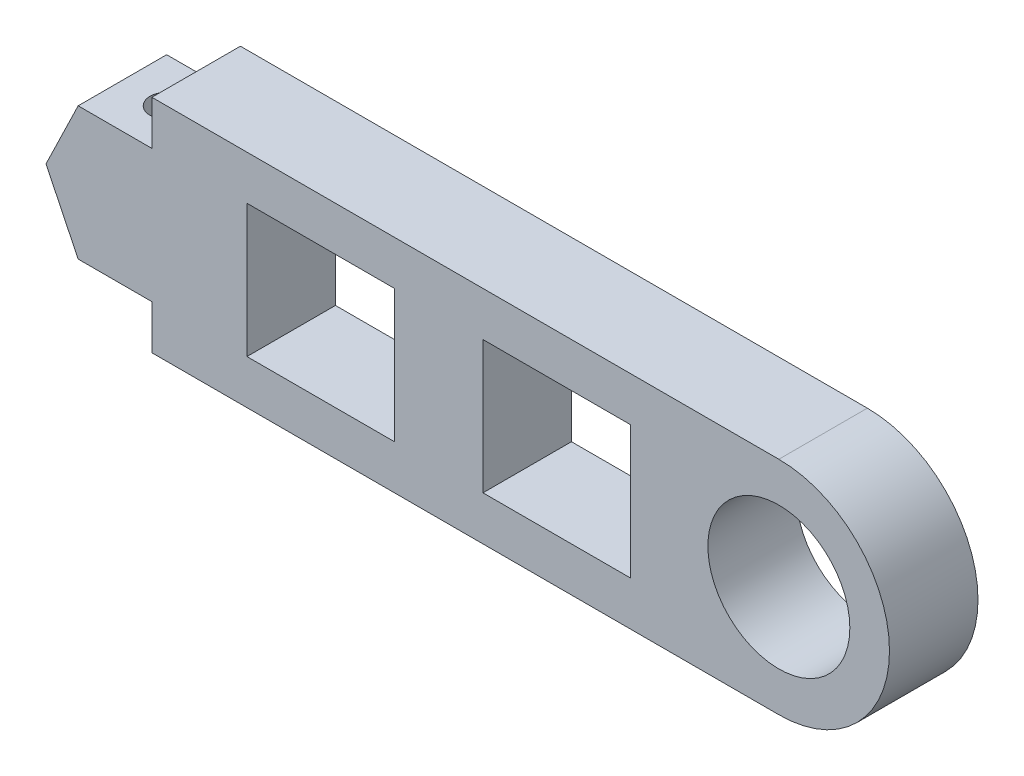
ISO-10303-21;
HEADER;
FILE_DESCRIPTION(('STEP AP214'),'2;1');
FILE_NAME('part.step','',(''),(''),'','','');
FILE_SCHEMA(('AUTOMOTIVE_DESIGN { 1 0 10303 214 1 1 1 1 }'));
ENDSEC;
DATA;
#1=APPLICATION_CONTEXT('core data for automotive mechanical design processes');
#2=APPLICATION_PROTOCOL_DEFINITION('international standard','automotive_design',2000,#1);
#3=PRODUCT_CONTEXT('',#1,'mechanical');
#4=PRODUCT('Part','Part','',(#3));
#5=PRODUCT_RELATED_PRODUCT_CATEGORY('part','',(#4));
#6=PRODUCT_DEFINITION_FORMATION('','',#4);
#7=PRODUCT_DEFINITION_CONTEXT('part definition',#1,'design');
#8=PRODUCT_DEFINITION('design','',#6,#7);
#9=PRODUCT_DEFINITION_SHAPE('','',#8);
#10=(LENGTH_UNIT() NAMED_UNIT(*) SI_UNIT(.MILLI.,.METRE.));
#11=(NAMED_UNIT(*) PLANE_ANGLE_UNIT() SI_UNIT($,.RADIAN.));
#12=(NAMED_UNIT(*) SI_UNIT($,.STERADIAN.) SOLID_ANGLE_UNIT());
#13=UNCERTAINTY_MEASURE_WITH_UNIT(LENGTH_MEASURE(1.E-05),#10,'distance_accuracy_value','');
#14=(GEOMETRIC_REPRESENTATION_CONTEXT(3) GLOBAL_UNCERTAINTY_ASSIGNED_CONTEXT((#13)) GLOBAL_UNIT_ASSIGNED_CONTEXT((#10,
#11,#12)) REPRESENTATION_CONTEXT('',''));
#15=CARTESIAN_POINT('',(0.,0.,0.));
#16=DIRECTION('',(0.,0.,1.));
#17=DIRECTION('',(1.,0.,0.));
#18=AXIS2_PLACEMENT_3D('',#15,#16,#17);
#19=CARTESIAN_POINT('',(85.,0.,12.));
#20=DIRECTION('',(0.,0.,1.));
#21=DIRECTION('',(1.,0.,0.));
#22=AXIS2_PLACEMENT_3D('',#19,#20,#21);
#23=PLANE('',#22);
#24=DIRECTION('',(-1.,0.,0.));
#25=VECTOR('',#24,1.);
#26=CARTESIAN_POINT('',(0.,8.99999999999998,12.));
#27=LINE('',#26,#25);
#28=CARTESIAN_POINT('',(0.,8.99999999999998,12.));
#29=VERTEX_POINT('',#28);
#30=CARTESIAN_POINT('',(-10.,8.99999999999998,12.));
#31=VERTEX_POINT('',#30);
#32=EDGE_CURVE('E227',#29,#31,#27,.T.);
#33=ORIENTED_EDGE('',*,*,#32,.T.);
#34=DIRECTION('',(-0.435889894354068,-0.9,0.));
#35=VECTOR('',#34,1.);
#36=CARTESIAN_POINT('',(-10.,8.99999999999998,12.));
#37=LINE('',#36,#35);
#38=CARTESIAN_POINT('',(-14.3588989435407,0.,12.));
#39=VERTEX_POINT('',#38);
#40=EDGE_CURVE('E230',#31,#39,#37,.T.);
#41=ORIENTED_EDGE('',*,*,#40,.T.);
#42=DIRECTION('',(0.435889894354067,-0.9,0.));
#43=VECTOR('',#42,1.);
#44=CARTESIAN_POINT('',(-14.3588989435407,0.,12.));
#45=LINE('',#44,#43);
#46=CARTESIAN_POINT('',(-10.,-9.,12.));
#47=VERTEX_POINT('',#46);
#48=EDGE_CURVE('E233',#39,#47,#45,.T.);
#49=ORIENTED_EDGE('',*,*,#48,.T.);
#50=DIRECTION('',(1.,0.,0.));
#51=VECTOR('',#50,1.);
#52=CARTESIAN_POINT('',(-10.,-9.,12.));
#53=LINE('',#52,#51);
#54=CARTESIAN_POINT('',(0.,-9.,12.));
#55=VERTEX_POINT('',#54);
#56=EDGE_CURVE('E235',#47,#55,#53,.T.);
#57=ORIENTED_EDGE('',*,*,#56,.T.);
#58=DIRECTION('',(0.,-1.,0.));
#59=VECTOR('',#58,1.);
#60=CARTESIAN_POINT('',(0.,-9.,12.));
#61=LINE('',#60,#59);
#62=CARTESIAN_POINT('',(0.,-15.,12.));
#63=VERTEX_POINT('',#62);
#64=EDGE_CURVE('E237',#55,#63,#61,.T.);
#65=ORIENTED_EDGE('',*,*,#64,.T.);
#66=DIRECTION('',(1.,0.,0.));
#67=VECTOR('',#66,1.);
#68=CARTESIAN_POINT('',(0.,-15.,12.));
#69=LINE('',#68,#67);
#70=CARTESIAN_POINT('',(85.,-15.,12.));
#71=VERTEX_POINT('',#70);
#72=EDGE_CURVE('E239',#63,#71,#69,.T.);
#73=ORIENTED_EDGE('',*,*,#72,.T.);
#74=CARTESIAN_POINT('',(85.,0.,12.));
#75=DIRECTION('',(0.,0.,1.));
#76=DIRECTION('',(1.,0.,0.));
#77=AXIS2_PLACEMENT_3D('',#74,#75,#76);
#78=CIRCLE('',#77,15.);
#79=CARTESIAN_POINT('',(85.,15.,12.));
#80=VERTEX_POINT('',#79);
#81=EDGE_CURVE('E241',#71,#80,#78,.T.);
#82=ORIENTED_EDGE('',*,*,#81,.T.);
#83=DIRECTION('',(-1.,0.,0.));
#84=VECTOR('',#83,1.);
#85=CARTESIAN_POINT('',(0.,15.,12.));
#86=LINE('',#85,#84);
#87=CARTESIAN_POINT('',(0.,15.,12.));
#88=VERTEX_POINT('',#87);
#89=EDGE_CURVE('E243',#80,#88,#86,.T.);
#90=ORIENTED_EDGE('',*,*,#89,.T.);
#91=DIRECTION('',(0.,-1.,0.));
#92=VECTOR('',#91,1.);
#93=CARTESIAN_POINT('',(0.,15.,12.));
#94=LINE('',#93,#92);
#95=EDGE_CURVE('E245',#88,#29,#94,.T.);
#96=ORIENTED_EDGE('',*,*,#95,.T.);
#97=EDGE_LOOP('',(#33,#41,#49,#57,#65,#73,#82,#90,#96));
#98=FACE_BOUND('',#97,.T.);
#99=CARTESIAN_POINT('',(85.,0.,12.));
#100=DIRECTION('',(0.,0.,1.));
#101=DIRECTION('',(1.,0.,0.));
#102=AXIS2_PLACEMENT_3D('',#99,#100,#101);
#103=CIRCLE('',#102,9.62499999999999);
#104=CARTESIAN_POINT('',(94.625,0.,12.));
#105=VERTEX_POINT('',#104);
#106=EDGE_CURVE('E221',#105,#105,#103,.T.);
#107=ORIENTED_EDGE('',*,*,#106,.F.);
#108=EDGE_LOOP('',(#107));
#109=FACE_BOUND('',#108,.T.);
#110=DIRECTION('',(1.,0.,0.));
#111=VECTOR('',#110,1.);
#112=CARTESIAN_POINT('',(12.884427268704,-9.,12.));
#113=LINE('',#112,#111);
#114=CARTESIAN_POINT('',(12.884427268704,-9.,12.));
#115=VERTEX_POINT('',#114);
#116=CARTESIAN_POINT('',(32.884427268704,-9.,12.));
#117=VERTEX_POINT('',#116);
#118=EDGE_CURVE('E192',#115,#117,#113,.T.);
#119=ORIENTED_EDGE('',*,*,#118,.F.);
#120=DIRECTION('',(0.,-1.,0.));
#121=VECTOR('',#120,1.);
#122=CARTESIAN_POINT('',(12.884427268704,8.99999999999998,12.));
#123=LINE('',#122,#121);
#124=CARTESIAN_POINT('',(12.884427268704,8.99999999999998,12.));
#125=VERTEX_POINT('',#124);
#126=EDGE_CURVE('E190',#125,#115,#123,.T.);
#127=ORIENTED_EDGE('',*,*,#126,.F.);
#128=DIRECTION('',(-1.,0.,0.));
#129=VECTOR('',#128,1.);
#130=CARTESIAN_POINT('',(12.884427268704,8.99999999999998,12.));
#131=LINE('',#130,#129);
#132=CARTESIAN_POINT('',(32.884427268704,8.99999999999998,12.));
#133=VERTEX_POINT('',#132);
#134=EDGE_CURVE('E198',#133,#125,#131,.T.);
#135=ORIENTED_EDGE('',*,*,#134,.F.);
#136=DIRECTION('',(0.,1.,0.));
#137=VECTOR('',#136,1.);
#138=CARTESIAN_POINT('',(32.884427268704,8.99999999999998,12.));
#139=LINE('',#138,#137);
#140=EDGE_CURVE('E195',#117,#133,#139,.T.);
#141=ORIENTED_EDGE('',*,*,#140,.F.);
#142=EDGE_LOOP('',(#119,#127,#135,#141));
#143=FACE_BOUND('',#142,.T.);
#144=DIRECTION('',(1.,0.,0.));
#145=VECTOR('',#144,1.);
#146=CARTESIAN_POINT('',(44.884427268704,-9.,12.));
#147=LINE('',#146,#145);
#148=CARTESIAN_POINT('',(44.884427268704,-9.,12.));
#149=VERTEX_POINT('',#148);
#150=CARTESIAN_POINT('',(64.884427268704,-9.,12.));
#151=VERTEX_POINT('',#150);
#152=EDGE_CURVE('E160',#149,#151,#147,.T.);
#153=ORIENTED_EDGE('',*,*,#152,.F.);
#154=DIRECTION('',(0.,-1.,0.));
#155=VECTOR('',#154,1.);
#156=CARTESIAN_POINT('',(44.884427268704,8.99999999999998,12.));
#157=LINE('',#156,#155);
#158=CARTESIAN_POINT('',(44.884427268704,8.99999999999998,12.));
#159=VERTEX_POINT('',#158);
#160=EDGE_CURVE('E152',#159,#149,#157,.T.);
#161=ORIENTED_EDGE('',*,*,#160,.F.);
#162=DIRECTION('',(-1.,0.,0.));
#163=VECTOR('',#162,1.);
#164=CARTESIAN_POINT('',(44.884427268704,8.99999999999998,12.));
#165=LINE('',#164,#163);
#166=CARTESIAN_POINT('',(64.884427268704,8.99999999999998,12.));
#167=VERTEX_POINT('',#166);
#168=EDGE_CURVE('E174',#167,#159,#165,.T.);
#169=ORIENTED_EDGE('',*,*,#168,.F.);
#170=DIRECTION('',(0.,1.,0.));
#171=VECTOR('',#170,1.);
#172=CARTESIAN_POINT('',(64.884427268704,8.99999999999998,12.));
#173=LINE('',#172,#171);
#174=EDGE_CURVE('E172',#151,#167,#173,.T.);
#175=ORIENTED_EDGE('',*,*,#174,.F.);
#176=EDGE_LOOP('',(#153,#161,#169,#175));
#177=FACE_BOUND('',#176,.T.);
#178=ADVANCED_FACE('F33',(#98,#109,#143,#177),#23,.T.);
#179=CARTESIAN_POINT('',(85.,0.,0.));
#180=DIRECTION('',(0.,0.,1.));
#181=DIRECTION('',(1.,0.,0.));
#182=AXIS2_PLACEMENT_3D('',#179,#180,#181);
#183=PLANE('',#182);
#184=DIRECTION('',(0.,-1.,0.));
#185=VECTOR('',#184,1.);
#186=CARTESIAN_POINT('',(12.884427268704,8.99999999999998,0.));
#187=LINE('',#186,#185);
#188=CARTESIAN_POINT('',(12.884427268704,8.99999999999998,0.));
#189=VERTEX_POINT('',#188);
#190=CARTESIAN_POINT('',(12.884427268704,-9.,0.));
#191=VERTEX_POINT('',#190);
#192=EDGE_CURVE('E168',#189,#191,#187,.T.);
#193=ORIENTED_EDGE('',*,*,#192,.T.);
#194=DIRECTION('',(1.,0.,0.));
#195=VECTOR('',#194,1.);
#196=CARTESIAN_POINT('',(12.884427268704,-9.,0.));
#197=LINE('',#196,#195);
#198=CARTESIAN_POINT('',(32.884427268704,-9.,0.));
#199=VERTEX_POINT('',#198);
#200=EDGE_CURVE('E203',#191,#199,#197,.T.);
#201=ORIENTED_EDGE('',*,*,#200,.T.);
#202=DIRECTION('',(0.,1.,0.));
#203=VECTOR('',#202,1.);
#204=CARTESIAN_POINT('',(32.884427268704,8.99999999999998,0.));
#205=LINE('',#204,#203);
#206=CARTESIAN_POINT('',(32.884427268704,8.99999999999998,0.));
#207=VERTEX_POINT('',#206);
#208=EDGE_CURVE('E206',#199,#207,#205,.T.);
#209=ORIENTED_EDGE('',*,*,#208,.T.);
#210=DIRECTION('',(-1.,0.,0.));
#211=VECTOR('',#210,1.);
#212=CARTESIAN_POINT('',(12.884427268704,8.99999999999998,0.));
#213=LINE('',#212,#211);
#214=EDGE_CURVE('E193',#207,#189,#213,.T.);
#215=ORIENTED_EDGE('',*,*,#214,.T.);
#216=EDGE_LOOP('',(#193,#201,#209,#215));
#217=FACE_BOUND('',#216,.T.);
#218=DIRECTION('',(-1.,0.,0.));
#219=VECTOR('',#218,1.);
#220=CARTESIAN_POINT('',(0.,8.99999999999998,0.));
#221=LINE('',#220,#219);
#222=CARTESIAN_POINT('',(0.,8.99999999999998,0.));
#223=VERTEX_POINT('',#222);
#224=CARTESIAN_POINT('',(-10.,8.99999999999998,0.));
#225=VERTEX_POINT('',#224);
#226=EDGE_CURVE('E224',#223,#225,#221,.T.);
#227=ORIENTED_EDGE('',*,*,#226,.F.);
#228=DIRECTION('',(0.,-1.,0.));
#229=VECTOR('',#228,1.);
#230=CARTESIAN_POINT('',(0.,15.,0.));
#231=LINE('',#230,#229);
#232=CARTESIAN_POINT('',(0.,15.,0.));
#233=VERTEX_POINT('',#232);
#234=EDGE_CURVE('E231',#233,#223,#231,.T.);
#235=ORIENTED_EDGE('',*,*,#234,.F.);
#236=DIRECTION('',(-1.,0.,0.));
#237=VECTOR('',#236,1.);
#238=CARTESIAN_POINT('',(0.,15.,0.));
#239=LINE('',#238,#237);
#240=CARTESIAN_POINT('',(85.,15.,0.));
#241=VERTEX_POINT('',#240);
#242=EDGE_CURVE('E262',#241,#233,#239,.T.);
#243=ORIENTED_EDGE('',*,*,#242,.F.);
#244=CARTESIAN_POINT('',(85.,0.,0.));
#245=DIRECTION('',(0.,0.,1.));
#246=DIRECTION('',(1.,0.,0.));
#247=AXIS2_PLACEMENT_3D('',#244,#245,#246);
#248=CIRCLE('',#247,15.);
#249=CARTESIAN_POINT('',(85.,-15.,0.));
#250=VERTEX_POINT('',#249);
#251=EDGE_CURVE('E260',#250,#241,#248,.T.);
#252=ORIENTED_EDGE('',*,*,#251,.F.);
#253=DIRECTION('',(1.,0.,0.));
#254=VECTOR('',#253,1.);
#255=CARTESIAN_POINT('',(0.,-15.,0.));
#256=LINE('',#255,#254);
#257=CARTESIAN_POINT('',(0.,-15.,0.));
#258=VERTEX_POINT('',#257);
#259=EDGE_CURVE('E258',#258,#250,#256,.T.);
#260=ORIENTED_EDGE('',*,*,#259,.F.);
#261=DIRECTION('',(0.,-1.,0.));
#262=VECTOR('',#261,1.);
#263=CARTESIAN_POINT('',(0.,-9.,0.));
#264=LINE('',#263,#262);
#265=CARTESIAN_POINT('',(0.,-9.,0.));
#266=VERTEX_POINT('',#265);
#267=EDGE_CURVE('E256',#266,#258,#264,.T.);
#268=ORIENTED_EDGE('',*,*,#267,.F.);
#269=DIRECTION('',(1.,0.,0.));
#270=VECTOR('',#269,1.);
#271=CARTESIAN_POINT('',(-10.,-9.,0.));
#272=LINE('',#271,#270);
#273=CARTESIAN_POINT('',(-10.,-9.,0.));
#274=VERTEX_POINT('',#273);
#275=EDGE_CURVE('E254',#274,#266,#272,.T.);
#276=ORIENTED_EDGE('',*,*,#275,.F.);
#277=DIRECTION('',(0.435889894354067,-0.9,0.));
#278=VECTOR('',#277,1.);
#279=CARTESIAN_POINT('',(-14.3588989435407,0.,0.));
#280=LINE('',#279,#278);
#281=CARTESIAN_POINT('',(-14.3588989435407,0.,0.));
#282=VERTEX_POINT('',#281);
#283=EDGE_CURVE('E252',#282,#274,#280,.T.);
#284=ORIENTED_EDGE('',*,*,#283,.F.);
#285=DIRECTION('',(-0.435889894354068,-0.9,0.));
#286=VECTOR('',#285,1.);
#287=CARTESIAN_POINT('',(-10.,8.99999999999998,0.));
#288=LINE('',#287,#286);
#289=EDGE_CURVE('E250',#225,#282,#288,.T.);
#290=ORIENTED_EDGE('',*,*,#289,.F.);
#291=EDGE_LOOP('',(#227,#235,#243,#252,#260,#268,#276,#284,#290));
#292=FACE_BOUND('',#291,.T.);
#293=CARTESIAN_POINT('',(85.,0.,0.));
#294=DIRECTION('',(0.,0.,1.));
#295=DIRECTION('',(1.,0.,0.));
#296=AXIS2_PLACEMENT_3D('',#293,#294,#295);
#297=CIRCLE('',#296,9.62499999999999);
#298=CARTESIAN_POINT('',(94.625,0.,0.));
#299=VERTEX_POINT('',#298);
#300=EDGE_CURVE('E220',#299,#299,#297,.T.);
#301=ORIENTED_EDGE('',*,*,#300,.T.);
#302=EDGE_LOOP('',(#301));
#303=FACE_BOUND('',#302,.T.);
#304=DIRECTION('',(0.,-1.,0.));
#305=VECTOR('',#304,1.);
#306=CARTESIAN_POINT('',(44.884427268704,8.99999999999998,0.));
#307=LINE('',#306,#305);
#308=CARTESIAN_POINT('',(44.884427268704,8.99999999999998,0.));
#309=VERTEX_POINT('',#308);
#310=CARTESIAN_POINT('',(44.884427268704,-9.,0.));
#311=VERTEX_POINT('',#310);
#312=EDGE_CURVE('E56',#309,#311,#307,.T.);
#313=ORIENTED_EDGE('',*,*,#312,.T.);
#314=DIRECTION('',(1.,0.,0.));
#315=VECTOR('',#314,1.);
#316=CARTESIAN_POINT('',(44.884427268704,-9.,0.));
#317=LINE('',#316,#315);
#318=CARTESIAN_POINT('',(64.884427268704,-9.,0.));
#319=VERTEX_POINT('',#318);
#320=EDGE_CURVE('E167',#311,#319,#317,.T.);
#321=ORIENTED_EDGE('',*,*,#320,.T.);
#322=DIRECTION('',(0.,1.,0.));
#323=VECTOR('',#322,1.);
#324=CARTESIAN_POINT('',(64.884427268704,8.99999999999998,0.));
#325=LINE('',#324,#323);
#326=CARTESIAN_POINT('',(64.884427268704,8.99999999999998,0.));
#327=VERTEX_POINT('',#326);
#328=EDGE_CURVE('E182',#319,#327,#325,.T.);
#329=ORIENTED_EDGE('',*,*,#328,.T.);
#330=DIRECTION('',(-1.,0.,0.));
#331=VECTOR('',#330,1.);
#332=CARTESIAN_POINT('',(44.884427268704,8.99999999999998,0.));
#333=LINE('',#332,#331);
#334=EDGE_CURVE('E161',#327,#309,#333,.T.);
#335=ORIENTED_EDGE('',*,*,#334,.T.);
#336=EDGE_LOOP('',(#313,#321,#329,#335));
#337=FACE_BOUND('',#336,.T.);
#338=ADVANCED_FACE('F295',(#217,#292,#303,#337),#183,.F.);
#339=CARTESIAN_POINT('',(0.,8.99999999999998,12.));
#340=DIRECTION('',(0.,-1.,0.));
#341=DIRECTION('',(1.,0.,0.));
#342=AXIS2_PLACEMENT_3D('',#339,#340,#341);
#343=PLANE('',#342);
#344=CARTESIAN_POINT('',(-4.,8.99999999999998,6.));
#345=DIRECTION('',(0.,-1.,0.));
#346=DIRECTION('',(1.,0.,0.));
#347=AXIS2_PLACEMENT_3D('',#344,#345,#346);
#348=CIRCLE('',#347,2.25);
#349=CARTESIAN_POINT('',(-1.75,8.99999999999998,6.));
#350=VERTEX_POINT('',#349);
#351=EDGE_CURVE('E180',#350,#350,#348,.T.);
#352=ORIENTED_EDGE('',*,*,#351,.T.);
#353=EDGE_LOOP('',(#352));
#354=FACE_BOUND('',#353,.T.);
#355=ORIENTED_EDGE('',*,*,#226,.T.);
#356=DIRECTION('',(0.,0.,-1.));
#357=VECTOR('',#356,1.);
#358=CARTESIAN_POINT('',(-10.,8.99999999999998,12.));
#359=LINE('',#358,#357);
#360=EDGE_CURVE('E11',#31,#225,#359,.T.);
#361=ORIENTED_EDGE('',*,*,#360,.F.);
#362=ORIENTED_EDGE('',*,*,#32,.F.);
#363=DIRECTION('',(0.,0.,-1.));
#364=VECTOR('',#363,1.);
#365=CARTESIAN_POINT('',(0.,8.99999999999998,12.));
#366=LINE('',#365,#364);
#367=EDGE_CURVE('E247',#29,#223,#366,.T.);
#368=ORIENTED_EDGE('',*,*,#367,.T.);
#369=EDGE_LOOP('',(#355,#361,#362,#368));
#370=FACE_BOUND('',#369,.T.);
#371=ADVANCED_FACE('F35',(#354,#370),#343,.F.);
#372=CARTESIAN_POINT('',(-10.,8.99999999999998,12.));
#373=DIRECTION('',(0.9,-0.435889894354068,0.));
#374=DIRECTION('',(0.435889894354068,0.9,0.));
#375=AXIS2_PLACEMENT_3D('',#372,#373,#374);
#376=PLANE('',#375);
#377=ORIENTED_EDGE('',*,*,#289,.T.);
#378=DIRECTION('',(0.,0.,-1.));
#379=VECTOR('',#378,1.);
#380=CARTESIAN_POINT('',(-14.3588989435407,0.,12.));
#381=LINE('',#380,#379);
#382=EDGE_CURVE('E41',#39,#282,#381,.T.);
#383=ORIENTED_EDGE('',*,*,#382,.F.);
#384=ORIENTED_EDGE('',*,*,#40,.F.);
#385=ORIENTED_EDGE('',*,*,#360,.T.);
#386=EDGE_LOOP('',(#377,#383,#384,#385));
#387=FACE_BOUND('',#386,.T.);
#388=ADVANCED_FACE('F313',(#387),#376,.F.);
#389=CARTESIAN_POINT('',(-14.3588989435407,0.,12.));
#390=DIRECTION('',(0.9,0.435889894354067,0.));
#391=DIRECTION('',(-0.435889894354067,0.9,0.));
#392=AXIS2_PLACEMENT_3D('',#389,#390,#391);
#393=PLANE('',#392);
#394=ORIENTED_EDGE('',*,*,#283,.T.);
#395=DIRECTION('',(0.,0.,-1.));
#396=VECTOR('',#395,1.);
#397=CARTESIAN_POINT('',(-10.,-9.,12.));
#398=LINE('',#397,#396);
#399=EDGE_CURVE('E282',#47,#274,#398,.T.);
#400=ORIENTED_EDGE('',*,*,#399,.F.);
#401=ORIENTED_EDGE('',*,*,#48,.F.);
#402=ORIENTED_EDGE('',*,*,#382,.T.);
#403=EDGE_LOOP('',(#394,#400,#401,#402));
#404=FACE_BOUND('',#403,.T.);
#405=ADVANCED_FACE('F289',(#404),#393,.F.);
#406=CARTESIAN_POINT('',(-10.,-9.,12.));
#407=DIRECTION('',(0.,1.,0.));
#408=DIRECTION('',(-1.,0.,0.));
#409=AXIS2_PLACEMENT_3D('',#406,#407,#408);
#410=PLANE('',#409);
#411=CARTESIAN_POINT('',(-4.,-9.,6.));
#412=DIRECTION('',(0.,-1.,0.));
#413=DIRECTION('',(1.,0.,0.));
#414=AXIS2_PLACEMENT_3D('',#411,#412,#413);
#415=CIRCLE('',#414,2.25);
#416=CARTESIAN_POINT('',(-1.75,-9.,6.));
#417=VERTEX_POINT('',#416);
#418=EDGE_CURVE('E519',#417,#417,#415,.T.);
#419=ORIENTED_EDGE('',*,*,#418,.F.);
#420=EDGE_LOOP('',(#419));
#421=FACE_BOUND('',#420,.T.);
#422=ORIENTED_EDGE('',*,*,#275,.T.);
#423=DIRECTION('',(0.,0.,-1.));
#424=VECTOR('',#423,1.);
#425=CARTESIAN_POINT('',(0.,-9.,12.));
#426=LINE('',#425,#424);
#427=EDGE_CURVE('E279',#55,#266,#426,.T.);
#428=ORIENTED_EDGE('',*,*,#427,.F.);
#429=ORIENTED_EDGE('',*,*,#56,.F.);
#430=ORIENTED_EDGE('',*,*,#399,.T.);
#431=EDGE_LOOP('',(#422,#428,#429,#430));
#432=FACE_BOUND('',#431,.T.);
#433=ADVANCED_FACE('F301',(#421,#432),#410,.F.);
#434=CARTESIAN_POINT('',(0.,-9.,12.));
#435=DIRECTION('',(1.,0.,0.));
#436=DIRECTION('',(0.,1.,0.));
#437=AXIS2_PLACEMENT_3D('',#434,#435,#436);
#438=PLANE('',#437);
#439=ORIENTED_EDGE('',*,*,#267,.T.);
#440=DIRECTION('',(0.,0.,-1.));
#441=VECTOR('',#440,1.);
#442=CARTESIAN_POINT('',(0.,-15.,12.));
#443=LINE('',#442,#441);
#444=EDGE_CURVE('E276',#63,#258,#443,.T.);
#445=ORIENTED_EDGE('',*,*,#444,.F.);
#446=ORIENTED_EDGE('',*,*,#64,.F.);
#447=ORIENTED_EDGE('',*,*,#427,.T.);
#448=EDGE_LOOP('',(#439,#445,#446,#447));
#449=FACE_BOUND('',#448,.T.);
#450=ADVANCED_FACE('F305',(#449),#438,.F.);
#451=CARTESIAN_POINT('',(0.,-15.,12.));
#452=DIRECTION('',(0.,1.,0.));
#453=DIRECTION('',(0.,0.,1.));
#454=AXIS2_PLACEMENT_3D('',#451,#452,#453);
#455=PLANE('',#454);
#456=ORIENTED_EDGE('',*,*,#259,.T.);
#457=DIRECTION('',(0.,0.,-1.));
#458=VECTOR('',#457,1.);
#459=CARTESIAN_POINT('',(85.,-15.,12.));
#460=LINE('',#459,#458);
#461=EDGE_CURVE('E273',#71,#250,#460,.T.);
#462=ORIENTED_EDGE('',*,*,#461,.F.);
#463=ORIENTED_EDGE('',*,*,#72,.F.);
#464=ORIENTED_EDGE('',*,*,#444,.T.);
#465=EDGE_LOOP('',(#456,#462,#463,#464));
#466=FACE_BOUND('',#465,.T.);
#467=ADVANCED_FACE('F331',(#466),#455,.F.);
#468=CARTESIAN_POINT('',(85.,0.,12.));
#469=DIRECTION('',(0.,0.,-1.));
#470=DIRECTION('',(-1.,0.,0.));
#471=AXIS2_PLACEMENT_3D('',#468,#469,#470);
#472=CYLINDRICAL_SURFACE('',#471,15.);
#473=ORIENTED_EDGE('',*,*,#251,.T.);
#474=DIRECTION('',(0.,0.,-1.));
#475=VECTOR('',#474,1.);
#476=CARTESIAN_POINT('',(85.,15.,12.));
#477=LINE('',#476,#475);
#478=EDGE_CURVE('E270',#80,#241,#477,.T.);
#479=ORIENTED_EDGE('',*,*,#478,.F.);
#480=ORIENTED_EDGE('',*,*,#81,.F.);
#481=ORIENTED_EDGE('',*,*,#461,.T.);
#482=EDGE_LOOP('',(#473,#479,#480,#481));
#483=FACE_BOUND('',#482,.T.);
#484=ADVANCED_FACE('F329',(#483),#472,.T.);
#485=CARTESIAN_POINT('',(0.,15.,12.));
#486=DIRECTION('',(0.,-1.,0.));
#487=DIRECTION('',(0.,0.,-1.));
#488=AXIS2_PLACEMENT_3D('',#485,#486,#487);
#489=PLANE('',#488);
#490=ORIENTED_EDGE('',*,*,#242,.T.);
#491=DIRECTION('',(0.,0.,-1.));
#492=VECTOR('',#491,1.);
#493=CARTESIAN_POINT('',(0.,15.,12.));
#494=LINE('',#493,#492);
#495=EDGE_CURVE('E267',#88,#233,#494,.T.);
#496=ORIENTED_EDGE('',*,*,#495,.F.);
#497=ORIENTED_EDGE('',*,*,#89,.F.);
#498=ORIENTED_EDGE('',*,*,#478,.T.);
#499=EDGE_LOOP('',(#490,#496,#497,#498));
#500=FACE_BOUND('',#499,.T.);
#501=ADVANCED_FACE('F325',(#500),#489,.F.);
#502=CARTESIAN_POINT('',(0.,15.,12.));
#503=DIRECTION('',(1.,0.,0.));
#504=DIRECTION('',(0.,1.,0.));
#505=AXIS2_PLACEMENT_3D('',#502,#503,#504);
#506=PLANE('',#505);
#507=ORIENTED_EDGE('',*,*,#234,.T.);
#508=ORIENTED_EDGE('',*,*,#367,.F.);
#509=ORIENTED_EDGE('',*,*,#95,.F.);
#510=ORIENTED_EDGE('',*,*,#495,.T.);
#511=EDGE_LOOP('',(#507,#508,#509,#510));
#512=FACE_BOUND('',#511,.T.);
#513=ADVANCED_FACE('F320',(#512),#506,.F.);
#514=CARTESIAN_POINT('',(85.,0.,12.));
#515=DIRECTION('',(0.,0.,-1.));
#516=DIRECTION('',(-1.,0.,0.));
#517=AXIS2_PLACEMENT_3D('',#514,#515,#516);
#518=CYLINDRICAL_SURFACE('',#517,9.62499999999999);
#519=ORIENTED_EDGE('',*,*,#106,.T.);
#520=EDGE_LOOP('',(#519));
#521=FACE_BOUND('',#520,.T.);
#522=ORIENTED_EDGE('',*,*,#300,.F.);
#523=EDGE_LOOP('',(#522));
#524=FACE_BOUND('',#523,.T.);
#525=ADVANCED_FACE('F348',(#521,#524),#518,.F.);
#526=CARTESIAN_POINT('',(12.884427268704,8.99999999999998,12.));
#527=DIRECTION('',(1.,0.,0.));
#528=DIRECTION('',(0.,0.,-1.));
#529=AXIS2_PLACEMENT_3D('',#526,#527,#528);
#530=PLANE('',#529);
#531=ORIENTED_EDGE('',*,*,#192,.F.);
#532=DIRECTION('',(0.,0.,-1.));
#533=VECTOR('',#532,1.);
#534=CARTESIAN_POINT('',(12.884427268704,8.99999999999998,12.));
#535=LINE('',#534,#533);
#536=EDGE_CURVE('E200',#125,#189,#535,.T.);
#537=ORIENTED_EDGE('',*,*,#536,.F.);
#538=ORIENTED_EDGE('',*,*,#126,.T.);
#539=DIRECTION('',(0.,0.,-1.));
#540=VECTOR('',#539,1.);
#541=CARTESIAN_POINT('',(12.884427268704,-9.,12.));
#542=LINE('',#541,#540);
#543=EDGE_CURVE('E217',#115,#191,#542,.T.);
#544=ORIENTED_EDGE('',*,*,#543,.T.);
#545=EDGE_LOOP('',(#531,#537,#538,#544));
#546=FACE_BOUND('',#545,.T.);
#547=ADVANCED_FACE('F368',(#546),#530,.T.);
#548=CARTESIAN_POINT('',(12.884427268704,-9.,12.));
#549=DIRECTION('',(0.,1.,0.));
#550=DIRECTION('',(0.,0.,1.));
#551=AXIS2_PLACEMENT_3D('',#548,#549,#550);
#552=PLANE('',#551);
#553=ORIENTED_EDGE('',*,*,#200,.F.);
#554=ORIENTED_EDGE('',*,*,#543,.F.);
#555=ORIENTED_EDGE('',*,*,#118,.T.);
#556=DIRECTION('',(0.,0.,-1.));
#557=VECTOR('',#556,1.);
#558=CARTESIAN_POINT('',(32.884427268704,-9.,12.));
#559=LINE('',#558,#557);
#560=EDGE_CURVE('E215',#117,#199,#559,.T.);
#561=ORIENTED_EDGE('',*,*,#560,.T.);
#562=EDGE_LOOP('',(#553,#554,#555,#561));
#563=FACE_BOUND('',#562,.T.);
#564=ADVANCED_FACE('F375',(#563),#552,.T.);
#565=CARTESIAN_POINT('',(32.884427268704,8.99999999999998,12.));
#566=DIRECTION('',(-1.,0.,0.));
#567=DIRECTION('',(0.,0.,1.));
#568=AXIS2_PLACEMENT_3D('',#565,#566,#567);
#569=PLANE('',#568);
#570=ORIENTED_EDGE('',*,*,#208,.F.);
#571=ORIENTED_EDGE('',*,*,#560,.F.);
#572=ORIENTED_EDGE('',*,*,#140,.T.);
#573=DIRECTION('',(0.,0.,-1.));
#574=VECTOR('',#573,1.);
#575=CARTESIAN_POINT('',(32.884427268704,8.99999999999998,12.));
#576=LINE('',#575,#574);
#577=EDGE_CURVE('E213',#133,#207,#576,.T.);
#578=ORIENTED_EDGE('',*,*,#577,.T.);
#579=EDGE_LOOP('',(#570,#571,#572,#578));
#580=FACE_BOUND('',#579,.T.);
#581=ADVANCED_FACE('F382',(#580),#569,.T.);
#582=CARTESIAN_POINT('',(12.884427268704,8.99999999999998,12.));
#583=DIRECTION('',(0.,-1.,0.));
#584=DIRECTION('',(0.,0.,-1.));
#585=AXIS2_PLACEMENT_3D('',#582,#583,#584);
#586=PLANE('',#585);
#587=ORIENTED_EDGE('',*,*,#214,.F.);
#588=ORIENTED_EDGE('',*,*,#577,.F.);
#589=ORIENTED_EDGE('',*,*,#134,.T.);
#590=ORIENTED_EDGE('',*,*,#536,.T.);
#591=EDGE_LOOP('',(#587,#588,#589,#590));
#592=FACE_BOUND('',#591,.T.);
#593=ADVANCED_FACE('F390',(#592),#586,.T.);
#594=CARTESIAN_POINT('',(44.884427268704,8.99999999999998,12.));
#595=DIRECTION('',(1.,0.,0.));
#596=DIRECTION('',(0.,0.,-1.));
#597=AXIS2_PLACEMENT_3D('',#594,#595,#596);
#598=PLANE('',#597);
#599=ORIENTED_EDGE('',*,*,#312,.F.);
#600=DIRECTION('',(0.,0.,-1.));
#601=VECTOR('',#600,1.);
#602=CARTESIAN_POINT('',(44.884427268704,8.99999999999998,12.));
#603=LINE('',#602,#601);
#604=EDGE_CURVE('E156',#159,#309,#603,.T.);
#605=ORIENTED_EDGE('',*,*,#604,.F.);
#606=ORIENTED_EDGE('',*,*,#160,.T.);
#607=DIRECTION('',(0.,0.,-1.));
#608=VECTOR('',#607,1.);
#609=CARTESIAN_POINT('',(44.884427268704,-9.,12.));
#610=LINE('',#609,#608);
#611=EDGE_CURVE('E155',#149,#311,#610,.T.);
#612=ORIENTED_EDGE('',*,*,#611,.T.);
#613=EDGE_LOOP('',(#599,#605,#606,#612));
#614=FACE_BOUND('',#613,.T.);
#615=ADVANCED_FACE('F154',(#614),#598,.T.);
#616=CARTESIAN_POINT('',(44.884427268704,-9.,12.));
#617=DIRECTION('',(0.,1.,0.));
#618=DIRECTION('',(0.,0.,1.));
#619=AXIS2_PLACEMENT_3D('',#616,#617,#618);
#620=PLANE('',#619);
#621=ORIENTED_EDGE('',*,*,#320,.F.);
#622=ORIENTED_EDGE('',*,*,#611,.F.);
#623=ORIENTED_EDGE('',*,*,#152,.T.);
#624=DIRECTION('',(0.,0.,-1.));
#625=VECTOR('',#624,1.);
#626=CARTESIAN_POINT('',(64.884427268704,-9.,12.));
#627=LINE('',#626,#625);
#628=EDGE_CURVE('E169',#151,#319,#627,.T.);
#629=ORIENTED_EDGE('',*,*,#628,.T.);
#630=EDGE_LOOP('',(#621,#622,#623,#629));
#631=FACE_BOUND('',#630,.T.);
#632=ADVANCED_FACE('F164',(#631),#620,.T.);
#633=CARTESIAN_POINT('',(64.884427268704,8.99999999999998,12.));
#634=DIRECTION('',(-1.,0.,0.));
#635=DIRECTION('',(0.,0.,1.));
#636=AXIS2_PLACEMENT_3D('',#633,#634,#635);
#637=PLANE('',#636);
#638=ORIENTED_EDGE('',*,*,#328,.F.);
#639=ORIENTED_EDGE('',*,*,#628,.F.);
#640=ORIENTED_EDGE('',*,*,#174,.T.);
#641=DIRECTION('',(0.,0.,-1.));
#642=VECTOR('',#641,1.);
#643=CARTESIAN_POINT('',(64.884427268704,8.99999999999998,12.));
#644=LINE('',#643,#642);
#645=EDGE_CURVE('E48',#167,#327,#644,.T.);
#646=ORIENTED_EDGE('',*,*,#645,.T.);
#647=EDGE_LOOP('',(#638,#639,#640,#646));
#648=FACE_BOUND('',#647,.T.);
#649=ADVANCED_FACE('F411',(#648),#637,.T.);
#650=CARTESIAN_POINT('',(44.884427268704,8.99999999999998,12.));
#651=DIRECTION('',(0.,-1.,0.));
#652=DIRECTION('',(0.,0.,-1.));
#653=AXIS2_PLACEMENT_3D('',#650,#651,#652);
#654=PLANE('',#653);
#655=ORIENTED_EDGE('',*,*,#334,.F.);
#656=ORIENTED_EDGE('',*,*,#645,.F.);
#657=ORIENTED_EDGE('',*,*,#168,.T.);
#658=ORIENTED_EDGE('',*,*,#604,.T.);
#659=EDGE_LOOP('',(#655,#656,#657,#658));
#660=FACE_BOUND('',#659,.T.);
#661=ADVANCED_FACE('F418',(#660),#654,.T.);
#662=CARTESIAN_POINT('',(-4.,15.,6.));
#663=DIRECTION('',(0.,-1.,0.));
#664=DIRECTION('',(1.,0.,0.));
#665=AXIS2_PLACEMENT_3D('',#662,#663,#664);
#666=CYLINDRICAL_SURFACE('',#665,2.25);
#667=CARTESIAN_POINT('',(-1.75,-9.,6.));
#668=CARTESIAN_POINT('',(-1.75,-8.8125,6.));
#669=CARTESIAN_POINT('',(-1.75,-8.625,6.));
#670=CARTESIAN_POINT('',(-1.75,-8.25,6.));
#671=CARTESIAN_POINT('',(-1.75,-8.0625,6.));
#672=CARTESIAN_POINT('',(-1.75,-7.6875,6.));
#673=CARTESIAN_POINT('',(-1.75,-7.5,6.));
#674=CARTESIAN_POINT('',(-1.75,-7.125,6.));
#675=CARTESIAN_POINT('',(-1.75,-6.9375,6.));
#676=CARTESIAN_POINT('',(-1.75,-6.5625,6.));
#677=CARTESIAN_POINT('',(-1.75,-6.375,6.));
#678=CARTESIAN_POINT('',(-1.75,-6.,6.));
#679=CARTESIAN_POINT('',(-1.75,-5.8125,6.));
#680=CARTESIAN_POINT('',(-1.75,-5.4375,6.));
#681=CARTESIAN_POINT('',(-1.75,-5.25,6.));
#682=CARTESIAN_POINT('',(-1.75,-4.875,6.));
#683=CARTESIAN_POINT('',(-1.75,-4.6875,6.));
#684=CARTESIAN_POINT('',(-1.75,-4.3125,6.));
#685=CARTESIAN_POINT('',(-1.75,-4.125,6.));
#686=CARTESIAN_POINT('',(-1.75,-3.75,6.));
#687=CARTESIAN_POINT('',(-1.75,-3.5625,6.));
#688=CARTESIAN_POINT('',(-1.75,-3.18750000000001,6.));
#689=CARTESIAN_POINT('',(-1.75,-3.00000000000001,6.));
#690=CARTESIAN_POINT('',(-1.75,-2.62500000000001,6.));
#691=CARTESIAN_POINT('',(-1.75,-2.43750000000001,6.));
#692=CARTESIAN_POINT('',(-1.75,-2.06250000000001,6.));
#693=CARTESIAN_POINT('',(-1.75,-1.87500000000001,6.));
#694=CARTESIAN_POINT('',(-1.75,-1.50000000000001,6.));
#695=CARTESIAN_POINT('',(-1.75,-1.31250000000001,6.));
#696=CARTESIAN_POINT('',(-1.75,-0.937500000000007,6.));
#697=CARTESIAN_POINT('',(-1.75,-0.750000000000008,6.));
#698=CARTESIAN_POINT('',(-1.75,-0.37500000000001,6.));
#699=CARTESIAN_POINT('',(-1.75,-0.18750000000001,6.));
#700=CARTESIAN_POINT('',(-1.75,0.187499999999989,6.));
#701=CARTESIAN_POINT('',(-1.75,0.374999999999989,6.));
#702=CARTESIAN_POINT('',(-1.75,0.749999999999989,6.));
#703=CARTESIAN_POINT('',(-1.75,0.937499999999989,6.));
#704=CARTESIAN_POINT('',(-1.75,1.31249999999999,6.));
#705=CARTESIAN_POINT('',(-1.75,1.49999999999999,6.));
#706=CARTESIAN_POINT('',(-1.75,1.87499999999999,6.));
#707=CARTESIAN_POINT('',(-1.75,2.06249999999999,6.));
#708=CARTESIAN_POINT('',(-1.75,2.43749999999999,6.));
#709=CARTESIAN_POINT('',(-1.75,2.62499999999999,6.));
#710=CARTESIAN_POINT('',(-1.75,2.99999999999999,6.));
#711=CARTESIAN_POINT('',(-1.75,3.18749999999999,6.));
#712=CARTESIAN_POINT('',(-1.75,3.56249999999999,6.));
#713=CARTESIAN_POINT('',(-1.75,3.74999999999999,6.));
#714=CARTESIAN_POINT('',(-1.75,4.12499999999999,6.));
#715=CARTESIAN_POINT('',(-1.75,4.31249999999999,6.));
#716=CARTESIAN_POINT('',(-1.75,4.68749999999998,6.));
#717=CARTESIAN_POINT('',(-1.75,4.87499999999998,6.));
#718=CARTESIAN_POINT('',(-1.75,5.24999999999998,6.));
#719=CARTESIAN_POINT('',(-1.75,5.43749999999998,6.));
#720=CARTESIAN_POINT('',(-1.75,5.81249999999998,6.));
#721=CARTESIAN_POINT('',(-1.75,5.99999999999998,6.));
#722=CARTESIAN_POINT('',(-1.75,6.37499999999998,6.));
#723=CARTESIAN_POINT('',(-1.75,6.56249999999998,6.));
#724=CARTESIAN_POINT('',(-1.75,6.93749999999998,6.));
#725=CARTESIAN_POINT('',(-1.75,7.12499999999998,6.));
#726=CARTESIAN_POINT('',(-1.75,7.49999999999998,6.));
#727=CARTESIAN_POINT('',(-1.75,7.68749999999998,6.));
#728=CARTESIAN_POINT('',(-1.75,8.06249999999998,6.));
#729=CARTESIAN_POINT('',(-1.75,8.24999999999998,6.));
#730=CARTESIAN_POINT('',(-1.75,8.62499999999998,6.));
#731=CARTESIAN_POINT('',(-1.75,8.81249999999998,6.));
#732=CARTESIAN_POINT('',(-1.75,8.99999999999998,6.));
#733=B_SPLINE_CURVE_WITH_KNOTS('',3,(#667,#668,#669,#670,#671,#672,#673,#674,#675,#676,#677,
#678,#679,#680,#681,#682,#683,#684,#685,#686,#687,#688,#689,#690,#691,#692,#693,#694,#695,#696,
#697,#698,#699,#700,#701,#702,#703,#704,#705,#706,#707,#708,#709,#710,#711,#712,#713,#714,#715,
#716,#717,#718,#719,#720,#721,#722,#723,#724,#725,#726,#727,#728,#729,#730,#731,#732),
.UNSPECIFIED.,.F.,.F.,(4,2,2,2,2,2,2,2,2,2,2,2,2,2,2,2,2,2,2,2,2,2,2,2,2,2,2,2,2,2,2,2,4),(0.,
0.5625,1.125,1.6875,2.25,2.8125,3.375,3.9375,4.5,5.06249999999999,5.62499999999999,
6.18749999999999,6.74999999999999,7.31249999999999,7.87499999999999,8.43749999999999,
8.99999999999999,9.56249999999999,10.125,10.6875,11.25,11.8125,12.375,12.9375,13.5,14.0625,
14.625,15.1875,15.75,16.3125,16.875,17.4375,18.),.UNSPECIFIED.);
#734=EDGE_CURVE('BSEAM426',#417,#350,#733,.T.);
#735=ORIENTED_EDGE('',*,*,#418,.T.);
#736=ORIENTED_EDGE('',*,*,#351,.F.);
#737=ORIENTED_EDGE('',*,*,#734,.T.);
#738=ORIENTED_EDGE('',*,*,#734,.F.);
#739=EDGE_LOOP('',(#735,#737,#736,#738));
#740=FACE_BOUND('',#739,.T.);
#741=ADVANCED_FACE('F426',(#740),#666,.F.);
#742=CLOSED_SHELL('',(#178,#338,#371,#388,#405,#433,#450,#467,#484,#501,#513,#525,#547,#564,
#581,#593,#615,#632,#649,#661,#741));
#743=MANIFOLD_SOLID_BREP('B2',#742);
#744=ADVANCED_BREP_SHAPE_REPRESENTATION('',(#18,#743),#14);
#745=SHAPE_DEFINITION_REPRESENTATION(#9,#744);
ENDSEC;
END-ISO-10303-21;
